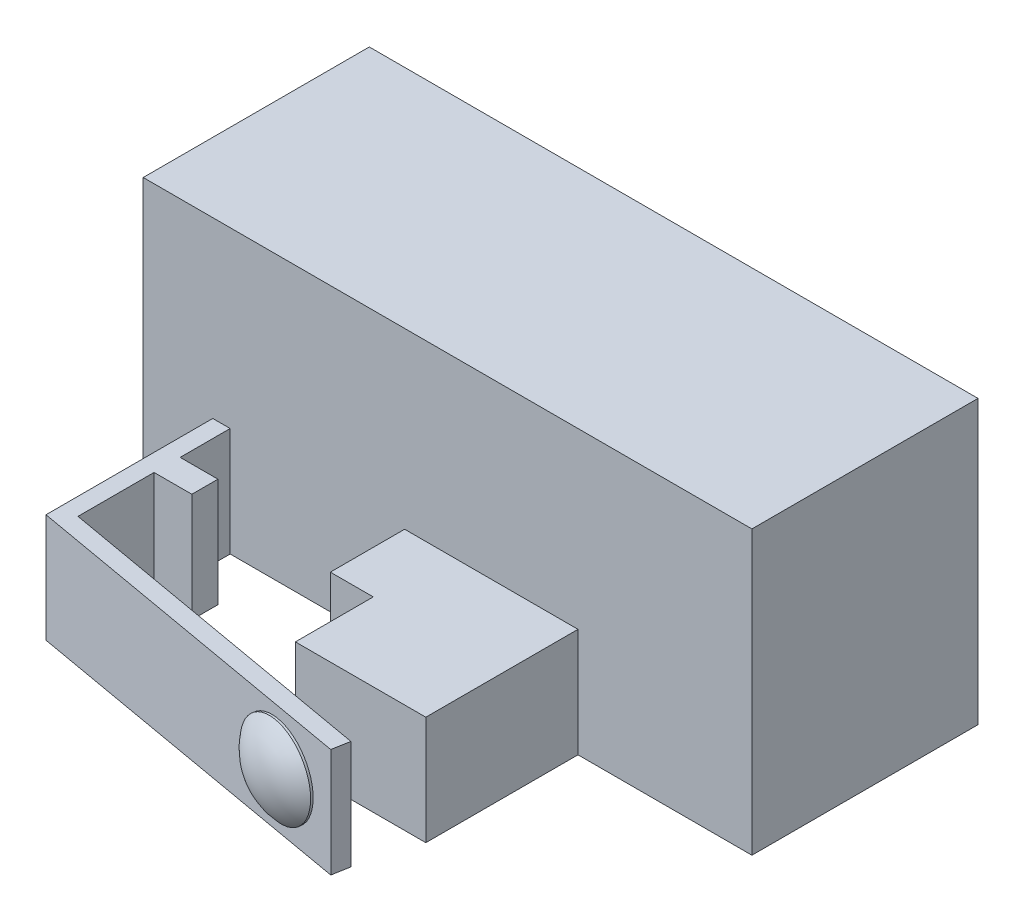
ISO-10303-21;
HEADER;
FILE_DESCRIPTION(('STEP AP214'),'2;1');
FILE_NAME('part.step','',(''),(''),'','','');
FILE_SCHEMA(('AUTOMOTIVE_DESIGN { 1 0 10303 214 1 1 1 1 }'));
ENDSEC;
DATA;
#1=APPLICATION_CONTEXT('core data for automotive mechanical design processes');
#2=APPLICATION_PROTOCOL_DEFINITION('international standard','automotive_design',2000,#1);
#3=PRODUCT_CONTEXT('',#1,'mechanical');
#4=PRODUCT('Part','Part','',(#3));
#5=PRODUCT_RELATED_PRODUCT_CATEGORY('part','',(#4));
#6=PRODUCT_DEFINITION_FORMATION('','',#4);
#7=PRODUCT_DEFINITION_CONTEXT('part definition',#1,'design');
#8=PRODUCT_DEFINITION('design','',#6,#7);
#9=PRODUCT_DEFINITION_SHAPE('','',#8);
#10=(LENGTH_UNIT() NAMED_UNIT(*) SI_UNIT(.MILLI.,.METRE.));
#11=(NAMED_UNIT(*) PLANE_ANGLE_UNIT() SI_UNIT($,.RADIAN.));
#12=(NAMED_UNIT(*) SI_UNIT($,.STERADIAN.) SOLID_ANGLE_UNIT());
#13=UNCERTAINTY_MEASURE_WITH_UNIT(LENGTH_MEASURE(1.E-05),#10,'distance_accuracy_value','');
#14=(GEOMETRIC_REPRESENTATION_CONTEXT(3) GLOBAL_UNCERTAINTY_ASSIGNED_CONTEXT((#13)) GLOBAL_UNIT_ASSIGNED_CONTEXT((#10,
#11,#12)) REPRESENTATION_CONTEXT('',''));
#15=CARTESIAN_POINT('',(0.,0.,0.));
#16=DIRECTION('',(0.,0.,1.));
#17=DIRECTION('',(1.,0.,0.));
#18=AXIS2_PLACEMENT_3D('',#15,#16,#17);
#19=CARTESIAN_POINT('',(-16.122641509434,-2.87735849056604,9.6));
#20=DIRECTION('',(1.,0.,0.));
#21=DIRECTION('',(0.,1.,0.));
#22=AXIS2_PLACEMENT_3D('',#19,#20,#21);
#23=PLANE('',#22);
#24=DIRECTION('',(0.,-1.,0.));
#25=VECTOR('',#24,1.);
#26=CARTESIAN_POINT('',(-16.122641509434,-2.87735849056604,0.));
#27=LINE('',#26,#25);
#28=CARTESIAN_POINT('',(-16.122641509434,-2.87735849056604,0.));
#29=VERTEX_POINT('',#28);
#30=CARTESIAN_POINT('',(-16.122641509434,-15.877358490566,0.));
#31=VERTEX_POINT('',#30);
#32=EDGE_CURVE('E381',#29,#31,#27,.T.);
#33=ORIENTED_EDGE('',*,*,#32,.T.);
#34=DIRECTION('',(0.,0.,-1.));
#35=VECTOR('',#34,1.);
#36=CARTESIAN_POINT('',(-16.122641509434,-15.877358490566,9.6));
#37=LINE('',#36,#35);
#38=CARTESIAN_POINT('',(-16.122641509434,-15.877358490566,10.4));
#39=VERTEX_POINT('',#38);
#40=EDGE_CURVE('E11',#39,#31,#37,.T.);
#41=ORIENTED_EDGE('',*,*,#40,.F.);
#42=DIRECTION('',(0.,-1.,0.));
#43=VECTOR('',#42,1.);
#44=CARTESIAN_POINT('',(-16.122641509434,-2.87735849056605,10.4));
#45=LINE('',#44,#43);
#46=CARTESIAN_POINT('',(-16.122641509434,-2.87735849056605,10.4));
#47=VERTEX_POINT('',#46);
#48=EDGE_CURVE('E219',#47,#39,#45,.T.);
#49=ORIENTED_EDGE('',*,*,#48,.F.);
#50=DIRECTION('',(0.,0.,-1.));
#51=VECTOR('',#50,1.);
#52=CARTESIAN_POINT('',(-16.122641509434,-2.87735849056604,9.6));
#53=LINE('',#52,#51);
#54=EDGE_CURVE('E398',#47,#29,#53,.T.);
#55=ORIENTED_EDGE('',*,*,#54,.T.);
#56=EDGE_LOOP('',(#33,#41,#49,#55));
#57=FACE_BOUND('',#56,.T.);
#58=ADVANCED_FACE('F45',(#57),#23,.F.);
#59=CARTESIAN_POINT('',(-12.122641509434,-15.877358490566,9.6));
#60=DIRECTION('',(-1.,0.,0.));
#61=DIRECTION('',(0.,0.,1.));
#62=AXIS2_PLACEMENT_3D('',#59,#60,#61);
#63=PLANE('',#62);
#64=DIRECTION('',(0.,1.,0.));
#65=VECTOR('',#64,1.);
#66=CARTESIAN_POINT('',(-12.122641509434,-15.877358490566,0.));
#67=LINE('',#66,#65);
#68=CARTESIAN_POINT('',(-12.122641509434,-15.877358490566,0.));
#69=VERTEX_POINT('',#68);
#70=CARTESIAN_POINT('',(-12.122641509434,-6.87735849056605,0.));
#71=VERTEX_POINT('',#70);
#72=EDGE_CURVE('E405',#69,#71,#67,.T.);
#73=ORIENTED_EDGE('',*,*,#72,.T.);
#74=DIRECTION('',(0.,0.,-1.));
#75=VECTOR('',#74,1.);
#76=CARTESIAN_POINT('',(-12.122641509434,-6.87735849056605,9.6));
#77=LINE('',#76,#75);
#78=CARTESIAN_POINT('',(-12.122641509434,-6.87735849056605,9.6));
#79=VERTEX_POINT('',#78);
#80=EDGE_CURVE('E439',#79,#71,#77,.T.);
#81=ORIENTED_EDGE('',*,*,#80,.F.);
#82=DIRECTION('',(0.,1.,0.));
#83=VECTOR('',#82,1.);
#84=CARTESIAN_POINT('',(-12.122641509434,-15.877358490566,9.6));
#85=LINE('',#84,#83);
#86=CARTESIAN_POINT('',(-12.122641509434,-15.877358490566,9.6));
#87=VERTEX_POINT('',#86);
#88=EDGE_CURVE('E385',#87,#79,#85,.T.);
#89=ORIENTED_EDGE('',*,*,#88,.F.);
#90=DIRECTION('',(0.,0.,-1.));
#91=VECTOR('',#90,1.);
#92=CARTESIAN_POINT('',(-12.122641509434,-15.877358490566,9.6));
#93=LINE('',#92,#91);
#94=EDGE_CURVE('E55',#87,#69,#93,.T.);
#95=ORIENTED_EDGE('',*,*,#94,.T.);
#96=EDGE_LOOP('',(#73,#81,#89,#95));
#97=FACE_BOUND('',#96,.T.);
#98=ADVANCED_FACE('F448',(#97),#63,.F.);
#99=CARTESIAN_POINT('',(-12.122641509434,-6.87735849056605,9.6));
#100=DIRECTION('',(0.,1.,0.));
#101=DIRECTION('',(0.,0.,1.));
#102=AXIS2_PLACEMENT_3D('',#99,#100,#101);
#103=PLANE('',#102);
#104=DIRECTION('',(1.,0.,0.));
#105=VECTOR('',#104,1.);
#106=CARTESIAN_POINT('',(-12.122641509434,-6.87735849056605,0.));
#107=LINE('',#106,#105);
#108=CARTESIAN_POINT('',(7.87735849056603,-6.87735849056605,0.));
#109=VERTEX_POINT('',#108);
#110=EDGE_CURVE('E408',#71,#109,#107,.T.);
#111=ORIENTED_EDGE('',*,*,#110,.T.);
#112=DIRECTION('',(0.,0.,-1.));
#113=VECTOR('',#112,1.);
#114=CARTESIAN_POINT('',(7.87735849056603,-6.87735849056605,9.6));
#115=LINE('',#114,#113);
#116=CARTESIAN_POINT('',(7.87735849056603,-6.87735849056605,9.6));
#117=VERTEX_POINT('',#116);
#118=EDGE_CURVE('E435',#117,#109,#115,.T.);
#119=ORIENTED_EDGE('',*,*,#118,.F.);
#120=DIRECTION('',(1.,0.,0.));
#121=VECTOR('',#120,1.);
#122=CARTESIAN_POINT('',(-12.122641509434,-6.87735849056605,9.6));
#123=LINE('',#122,#121);
#124=EDGE_CURVE('E389',#79,#117,#123,.T.);
#125=ORIENTED_EDGE('',*,*,#124,.F.);
#126=ORIENTED_EDGE('',*,*,#80,.T.);
#127=EDGE_LOOP('',(#111,#119,#125,#126));
#128=FACE_BOUND('',#127,.T.);
#129=ADVANCED_FACE('F457',(#128),#103,.F.);
#130=CARTESIAN_POINT('',(7.87735849056603,-6.87735849056605,9.6));
#131=DIRECTION('',(1.,0.,0.));
#132=DIRECTION('',(0.,1.,0.));
#133=AXIS2_PLACEMENT_3D('',#130,#131,#132);
#134=PLANE('',#133);
#135=DIRECTION('',(0.,-1.,0.));
#136=VECTOR('',#135,1.);
#137=CARTESIAN_POINT('',(7.87735849056603,-6.87735849056605,0.));
#138=LINE('',#137,#136);
#139=CARTESIAN_POINT('',(7.87735849056604,-15.877358490566,0.));
#140=VERTEX_POINT('',#139);
#141=EDGE_CURVE('E411',#109,#140,#138,.T.);
#142=ORIENTED_EDGE('',*,*,#141,.T.);
#143=DIRECTION('',(0.,0.,-1.));
#144=VECTOR('',#143,1.);
#145=CARTESIAN_POINT('',(7.87735849056604,-15.877358490566,9.6));
#146=LINE('',#145,#144);
#147=CARTESIAN_POINT('',(7.87735849056604,-15.877358490566,9.6));
#148=VERTEX_POINT('',#147);
#149=EDGE_CURVE('E431',#148,#140,#146,.T.);
#150=ORIENTED_EDGE('',*,*,#149,.F.);
#151=DIRECTION('',(0.,-1.,0.));
#152=VECTOR('',#151,1.);
#153=CARTESIAN_POINT('',(7.87735849056603,-6.87735849056605,9.6));
#154=LINE('',#153,#152);
#155=EDGE_CURVE('E394',#117,#148,#154,.T.);
#156=ORIENTED_EDGE('',*,*,#155,.F.);
#157=ORIENTED_EDGE('',*,*,#118,.T.);
#158=EDGE_LOOP('',(#142,#150,#156,#157));
#159=FACE_BOUND('',#158,.T.);
#160=ADVANCED_FACE('F461',(#159),#134,.F.);
#161=CARTESIAN_POINT('',(7.87735849056604,-15.877358490566,9.6));
#162=DIRECTION('',(0.,1.,0.));
#163=DIRECTION('',(-1.,0.,0.));
#164=AXIS2_PLACEMENT_3D('',#161,#162,#163);
#165=PLANE('',#164);
#166=DIRECTION('',(1.,0.,0.));
#167=VECTOR('',#166,1.);
#168=CARTESIAN_POINT('',(7.87735849056604,-15.877358490566,0.));
#169=LINE('',#168,#167);
#170=CARTESIAN_POINT('',(11.877358490566,-15.877358490566,0.));
#171=VERTEX_POINT('',#170);
#172=EDGE_CURVE('E414',#140,#171,#169,.T.);
#173=ORIENTED_EDGE('',*,*,#172,.T.);
#174=DIRECTION('',(0.,0.,-1.));
#175=VECTOR('',#174,1.);
#176=CARTESIAN_POINT('',(11.877358490566,-15.877358490566,9.6));
#177=LINE('',#176,#175);
#178=CARTESIAN_POINT('',(11.877358490566,-15.877358490566,10.4));
#179=VERTEX_POINT('',#178);
#180=EDGE_CURVE('E214',#179,#171,#177,.T.);
#181=ORIENTED_EDGE('',*,*,#180,.F.);
#182=DIRECTION('',(1.,0.,0.));
#183=VECTOR('',#182,1.);
#184=CARTESIAN_POINT('',(-16.122641509434,-15.877358490566,10.4));
#185=LINE('',#184,#183);
#186=CARTESIAN_POINT('',(3.87735849056604,-15.8773584905661,10.4));
#187=VERTEX_POINT('',#186);
#188=EDGE_CURVE('E208',#187,#179,#185,.T.);
#189=ORIENTED_EDGE('',*,*,#188,.F.);
#190=DIRECTION('',(0.,0.,1.));
#191=VECTOR('',#190,1.);
#192=CARTESIAN_POINT('',(3.87735849056604,-15.8773584905661,10.4));
#193=LINE('',#192,#191);
#194=CARTESIAN_POINT('',(3.87735849056604,-15.8773584905661,17.4));
#195=VERTEX_POINT('',#194);
#196=EDGE_CURVE('E212',#187,#195,#193,.T.);
#197=ORIENTED_EDGE('',*,*,#196,.T.);
#198=DIRECTION('',(-1.,0.,0.));
#199=VECTOR('',#198,1.);
#200=CARTESIAN_POINT('',(3.87735849056604,-15.8773584905661,17.4));
#201=LINE('',#200,#199);
#202=CARTESIAN_POINT('',(-2.12264150943396,-15.8773584905661,17.4));
#203=VERTEX_POINT('',#202);
#204=EDGE_CURVE('E234',#195,#203,#201,.T.);
#205=ORIENTED_EDGE('',*,*,#204,.T.);
#206=DIRECTION('',(0.,0.,-1.));
#207=VECTOR('',#206,1.);
#208=CARTESIAN_POINT('',(-2.12264150943396,-15.8773584905661,13.8174792770365));
#209=LINE('',#208,#207);
#210=CARTESIAN_POINT('',(-2.12264150943396,-15.8773584905661,13.8174792770365));
#211=VERTEX_POINT('',#210);
#212=EDGE_CURVE('E241',#203,#211,#209,.T.);
#213=ORIENTED_EDGE('',*,*,#212,.T.);
#214=DIRECTION('',(-1.,0.,0.));
#215=VECTOR('',#214,1.);
#216=CARTESIAN_POINT('',(-4.09686133363501,-15.8773584905661,13.8174792770365));
#217=LINE('',#216,#215);
#218=CARTESIAN_POINT('',(-4.09686133363501,-15.8773584905661,13.8174792770365));
#219=VERTEX_POINT('',#218);
#220=EDGE_CURVE('E495',#211,#219,#217,.T.);
#221=ORIENTED_EDGE('',*,*,#220,.T.);
#222=DIRECTION('',(0.,0.,-1.));
#223=VECTOR('',#222,1.);
#224=CARTESIAN_POINT('',(-4.09686133363501,-15.8773584905661,10.4));
#225=LINE('',#224,#223);
#226=CARTESIAN_POINT('',(-4.09686133363501,-15.877358490566,10.4));
#227=VERTEX_POINT('',#226);
#228=EDGE_CURVE('E265',#219,#227,#225,.T.);
#229=ORIENTED_EDGE('',*,*,#228,.T.);
#230=CARTESIAN_POINT('',(-12.122641509434,-15.877358490566,10.4));
#231=VERTEX_POINT('',#230);
#232=EDGE_CURVE('E218',#231,#227,#185,.T.);
#233=ORIENTED_EDGE('',*,*,#232,.F.);
#234=DIRECTION('',(0.,0.,1.));
#235=VECTOR('',#234,1.);
#236=CARTESIAN_POINT('',(-12.122641509434,-15.8773584905661,12.7));
#237=LINE('',#236,#235);
#238=CARTESIAN_POINT('',(-12.122641509434,-15.8773584905661,12.7));
#239=VERTEX_POINT('',#238);
#240=EDGE_CURVE('E271',#231,#239,#237,.T.);
#241=ORIENTED_EDGE('',*,*,#240,.T.);
#242=DIRECTION('',(1.,0.,0.));
#243=VECTOR('',#242,1.);
#244=CARTESIAN_POINT('',(-10.3845034350928,-15.8773584905661,12.7));
#245=LINE('',#244,#243);
#246=CARTESIAN_POINT('',(-10.3845034350928,-15.8773584905661,12.7));
#247=VERTEX_POINT('',#246);
#248=EDGE_CURVE('E233',#239,#247,#245,.T.);
#249=ORIENTED_EDGE('',*,*,#248,.T.);
#250=DIRECTION('',(0.,0.,1.));
#251=VECTOR('',#250,1.);
#252=CARTESIAN_POINT('',(-10.3845034350928,-15.8773584905661,13.9));
#253=LINE('',#252,#251);
#254=CARTESIAN_POINT('',(-10.3845034350928,-15.8773584905661,13.9));
#255=VERTEX_POINT('',#254);
#256=EDGE_CURVE('E239',#247,#255,#253,.T.);
#257=ORIENTED_EDGE('',*,*,#256,.T.);
#258=DIRECTION('',(-1.,0.,0.));
#259=VECTOR('',#258,1.);
#260=CARTESIAN_POINT('',(-12.122641509434,-15.8773584905661,13.9));
#261=LINE('',#260,#259);
#262=CARTESIAN_POINT('',(-12.122641509434,-15.8773584905661,13.9));
#263=VERTEX_POINT('',#262);
#264=EDGE_CURVE('E310',#255,#263,#261,.T.);
#265=ORIENTED_EDGE('',*,*,#264,.T.);
#266=DIRECTION('',(0.,0.,1.));
#267=VECTOR('',#266,1.);
#268=CARTESIAN_POINT('',(-12.122641509434,-15.8773584905661,17.4));
#269=LINE('',#268,#267);
#270=CARTESIAN_POINT('',(-12.122641509434,-15.8773584905661,17.4));
#271=VERTEX_POINT('',#270);
#272=EDGE_CURVE('E314',#263,#271,#269,.T.);
#273=ORIENTED_EDGE('',*,*,#272,.T.);
#274=DIRECTION('',(0.984807753012209,0.,0.173648177666928));
#275=VECTOR('',#274,1.);
#276=CARTESIAN_POINT('',(-12.122641509434,-15.8773584905661,17.4));
#277=LINE('',#276,#275);
#278=CARTESIAN_POINT('',(3.11911914186184,-15.8773584905661,20.087533636324));
#279=VERTEX_POINT('',#278);
#280=EDGE_CURVE('E318',#271,#279,#277,.T.);
#281=ORIENTED_EDGE('',*,*,#280,.T.);
#282=DIRECTION('',(-0.173648177666928,0.,0.984807753012209));
#283=VECTOR('',#282,1.);
#284=CARTESIAN_POINT('',(3.11911914186184,-15.8773584905661,20.087533636324));
#285=LINE('',#284,#283);
#286=CARTESIAN_POINT('',(2.9802005997283,-15.8773584905661,20.8753798387338));
#287=VERTEX_POINT('',#286);
#288=EDGE_CURVE('E322',#279,#287,#285,.T.);
#289=ORIENTED_EDGE('',*,*,#288,.T.);
#290=DIRECTION('',(-0.984807753012209,0.,-0.173648177666928));
#291=VECTOR('',#290,1.);
#292=CARTESIAN_POINT('',(2.9802005997283,-15.8773584905661,20.8753798387338));
#293=LINE('',#292,#291);
#294=CARTESIAN_POINT('',(-12.922641509434,-15.8773584905661,18.0712797049418));
#295=VERTEX_POINT('',#294);
#296=EDGE_CURVE('E326',#287,#295,#293,.T.);
#297=ORIENTED_EDGE('',*,*,#296,.T.);
#298=DIRECTION('',(0.,0.,-1.));
#299=VECTOR('',#298,1.);
#300=CARTESIAN_POINT('',(-12.922641509434,-15.8773584905661,10.4));
#301=LINE('',#300,#299);
#302=CARTESIAN_POINT('',(-12.922641509434,-15.8773584905661,10.4));
#303=VERTEX_POINT('',#302);
#304=EDGE_CURVE('E330',#295,#303,#301,.T.);
#305=ORIENTED_EDGE('',*,*,#304,.T.);
#306=EDGE_CURVE('E221',#39,#303,#185,.T.);
#307=ORIENTED_EDGE('',*,*,#306,.F.);
#308=ORIENTED_EDGE('',*,*,#40,.T.);
#309=DIRECTION('',(1.,0.,0.));
#310=VECTOR('',#309,1.);
#311=CARTESIAN_POINT('',(-16.122641509434,-15.877358490566,0.));
#312=LINE('',#311,#310);
#313=EDGE_CURVE('E402',#31,#69,#312,.T.);
#314=ORIENTED_EDGE('',*,*,#313,.T.);
#315=ORIENTED_EDGE('',*,*,#94,.F.);
#316=DIRECTION('',(1.,0.,0.));
#317=VECTOR('',#316,1.);
#318=CARTESIAN_POINT('',(-16.122641509434,-15.877358490566,9.6));
#319=LINE('',#318,#317);
#320=EDGE_CURVE('E340',#87,#148,#319,.T.);
#321=ORIENTED_EDGE('',*,*,#320,.T.);
#322=ORIENTED_EDGE('',*,*,#149,.T.);
#323=EDGE_LOOP('',(#173,#181,#189,#197,#205,#213,#221,#229,#233,#241,#249,#257,#265,#273,#281,
#289,#297,#305,#307,#308,#314,#315,#321,#322));
#324=FACE_BOUND('',#323,.T.);
#325=ADVANCED_FACE('F209',(#324),#165,.F.);
#326=CARTESIAN_POINT('',(11.877358490566,-15.877358490566,9.6));
#327=DIRECTION('',(-1.,0.,0.));
#328=DIRECTION('',(0.,0.,1.));
#329=AXIS2_PLACEMENT_3D('',#326,#327,#328);
#330=PLANE('',#329);
#331=DIRECTION('',(0.,1.,0.));
#332=VECTOR('',#331,1.);
#333=CARTESIAN_POINT('',(11.877358490566,-15.877358490566,0.));
#334=LINE('',#333,#332);
#335=CARTESIAN_POINT('',(11.877358490566,-2.87735849056604,0.));
#336=VERTEX_POINT('',#335);
#337=EDGE_CURVE('E417',#171,#336,#334,.T.);
#338=ORIENTED_EDGE('',*,*,#337,.T.);
#339=DIRECTION('',(0.,0.,-1.));
#340=VECTOR('',#339,1.);
#341=CARTESIAN_POINT('',(11.877358490566,-2.87735849056604,9.6));
#342=LINE('',#341,#340);
#343=CARTESIAN_POINT('',(11.877358490566,-2.87735849056605,10.4));
#344=VERTEX_POINT('',#343);
#345=EDGE_CURVE('E425',#344,#336,#342,.T.);
#346=ORIENTED_EDGE('',*,*,#345,.F.);
#347=DIRECTION('',(0.,1.,0.));
#348=VECTOR('',#347,1.);
#349=CARTESIAN_POINT('',(11.877358490566,-2.87735849056605,10.4));
#350=LINE('',#349,#348);
#351=EDGE_CURVE('E374',#179,#344,#350,.T.);
#352=ORIENTED_EDGE('',*,*,#351,.F.);
#353=ORIENTED_EDGE('',*,*,#180,.T.);
#354=EDGE_LOOP('',(#338,#346,#352,#353));
#355=FACE_BOUND('',#354,.T.);
#356=ADVANCED_FACE('F467',(#355),#330,.F.);
#357=CARTESIAN_POINT('',(11.877358490566,-2.87735849056604,9.6));
#358=DIRECTION('',(0.,-1.,0.));
#359=DIRECTION('',(1.,0.,0.));
#360=AXIS2_PLACEMENT_3D('',#357,#358,#359);
#361=PLANE('',#360);
#362=DIRECTION('',(-1.,0.,0.));
#363=VECTOR('',#362,1.);
#364=CARTESIAN_POINT('',(11.877358490566,-2.87735849056604,0.));
#365=LINE('',#364,#363);
#366=EDGE_CURVE('E390',#336,#29,#365,.T.);
#367=ORIENTED_EDGE('',*,*,#366,.T.);
#368=ORIENTED_EDGE('',*,*,#54,.F.);
#369=DIRECTION('',(-1.,0.,0.));
#370=VECTOR('',#369,1.);
#371=CARTESIAN_POINT('',(-16.122641509434,-2.87735849056605,10.4));
#372=LINE('',#371,#370);
#373=EDGE_CURVE('E377',#344,#47,#372,.T.);
#374=ORIENTED_EDGE('',*,*,#373,.F.);
#375=ORIENTED_EDGE('',*,*,#345,.T.);
#376=EDGE_LOOP('',(#367,#368,#374,#375));
#377=FACE_BOUND('',#376,.T.);
#378=ADVANCED_FACE('F470',(#377),#361,.F.);
#379=CARTESIAN_POINT('',(0.,0.,0.));
#380=DIRECTION('',(0.,0.,1.));
#381=DIRECTION('',(1.,0.,0.));
#382=AXIS2_PLACEMENT_3D('',#379,#380,#381);
#383=PLANE('',#382);
#384=ORIENTED_EDGE('',*,*,#32,.F.);
#385=ORIENTED_EDGE('',*,*,#366,.F.);
#386=ORIENTED_EDGE('',*,*,#337,.F.);
#387=ORIENTED_EDGE('',*,*,#172,.F.);
#388=ORIENTED_EDGE('',*,*,#141,.F.);
#389=ORIENTED_EDGE('',*,*,#110,.F.);
#390=ORIENTED_EDGE('',*,*,#72,.F.);
#391=ORIENTED_EDGE('',*,*,#313,.F.);
#392=EDGE_LOOP('',(#384,#385,#386,#387,#388,#389,#390,#391));
#393=FACE_BOUND('',#392,.T.);
#394=ADVANCED_FACE('F453',(#393),#383,.F.);
#395=CARTESIAN_POINT('',(0.,0.,9.6));
#396=DIRECTION('',(0.,0.,1.));
#397=DIRECTION('',(1.,0.,0.));
#398=AXIS2_PLACEMENT_3D('',#395,#396,#397);
#399=PLANE('',#398);
#400=ORIENTED_EDGE('',*,*,#320,.F.);
#401=ORIENTED_EDGE('',*,*,#88,.T.);
#402=ORIENTED_EDGE('',*,*,#124,.T.);
#403=ORIENTED_EDGE('',*,*,#155,.T.);
#404=EDGE_LOOP('',(#400,#401,#402,#403));
#405=FACE_BOUND('',#404,.T.);
#406=ADVANCED_FACE('F463',(#405),#399,.F.);
#407=CARTESIAN_POINT('',(0.,0.,10.4));
#408=DIRECTION('',(0.,0.,1.));
#409=DIRECTION('',(1.,0.,0.));
#410=AXIS2_PLACEMENT_3D('',#407,#408,#409);
#411=PLANE('',#410);
#412=DIRECTION('',(0.,-1.,0.));
#413=VECTOR('',#412,1.);
#414=CARTESIAN_POINT('',(3.87735849056604,-10.877358490566,10.4));
#415=LINE('',#414,#413);
#416=CARTESIAN_POINT('',(3.87735849056604,-10.877358490566,10.4));
#417=VERTEX_POINT('',#416);
#418=EDGE_CURVE('E222',#417,#187,#415,.T.);
#419=ORIENTED_EDGE('',*,*,#418,.T.);
#420=ORIENTED_EDGE('',*,*,#188,.T.);
#421=ORIENTED_EDGE('',*,*,#351,.T.);
#422=ORIENTED_EDGE('',*,*,#373,.T.);
#423=ORIENTED_EDGE('',*,*,#48,.T.);
#424=ORIENTED_EDGE('',*,*,#306,.T.);
#425=DIRECTION('',(0.,-1.,0.));
#426=VECTOR('',#425,1.);
#427=CARTESIAN_POINT('',(-12.922641509434,-10.8773584905661,10.4));
#428=LINE('',#427,#426);
#429=CARTESIAN_POINT('',(-12.922641509434,-10.8773584905661,10.4));
#430=VERTEX_POINT('',#429);
#431=EDGE_CURVE('E345',#430,#303,#428,.T.);
#432=ORIENTED_EDGE('',*,*,#431,.F.);
#433=DIRECTION('',(1.,0.,0.));
#434=VECTOR('',#433,1.);
#435=CARTESIAN_POINT('',(-12.122641509434,-10.8773584905661,10.4));
#436=LINE('',#435,#434);
#437=CARTESIAN_POINT('',(-12.122641509434,-10.8773584905661,10.4));
#438=VERTEX_POINT('',#437);
#439=EDGE_CURVE('E298',#430,#438,#436,.T.);
#440=ORIENTED_EDGE('',*,*,#439,.T.);
#441=DIRECTION('',(0.,-1.,0.));
#442=VECTOR('',#441,1.);
#443=CARTESIAN_POINT('',(-12.122641509434,-10.8773584905661,10.4));
#444=LINE('',#443,#442);
#445=EDGE_CURVE('E341',#438,#231,#444,.T.);
#446=ORIENTED_EDGE('',*,*,#445,.T.);
#447=ORIENTED_EDGE('',*,*,#232,.T.);
#448=DIRECTION('',(0.,-1.,0.));
#449=VECTOR('',#448,1.);
#450=CARTESIAN_POINT('',(-4.09686133363501,-10.8773584905661,10.4));
#451=LINE('',#450,#449);
#452=CARTESIAN_POINT('',(-4.09686133363501,-10.877358490566,10.4));
#453=VERTEX_POINT('',#452);
#454=EDGE_CURVE('E67',#453,#227,#451,.T.);
#455=ORIENTED_EDGE('',*,*,#454,.F.);
#456=DIRECTION('',(1.,0.,0.));
#457=VECTOR('',#456,1.);
#458=CARTESIAN_POINT('',(-4.09686133363501,-10.8773584905661,10.4));
#459=LINE('',#458,#457);
#460=EDGE_CURVE('E62',#453,#417,#459,.T.);
#461=ORIENTED_EDGE('',*,*,#460,.T.);
#462=EDGE_LOOP('',(#419,#420,#421,#422,#423,#424,#432,#440,#446,#447,#455,#461));
#463=FACE_BOUND('',#462,.T.);
#464=ADVANCED_FACE('F223',(#463),#411,.T.);
#465=CARTESIAN_POINT('',(-10.3845034350928,-10.8773584905661,12.7));
#466=DIRECTION('',(0.,0.,-1.));
#467=DIRECTION('',(-1.,0.,0.));
#468=AXIS2_PLACEMENT_3D('',#465,#466,#467);
#469=PLANE('',#468);
#470=ORIENTED_EDGE('',*,*,#248,.F.);
#471=DIRECTION('',(0.,-1.,0.));
#472=VECTOR('',#471,1.);
#473=CARTESIAN_POINT('',(-12.122641509434,-10.8773584905661,12.7));
#474=LINE('',#473,#472);
#475=CARTESIAN_POINT('',(-12.122641509434,-10.8773584905661,12.7));
#476=VERTEX_POINT('',#475);
#477=EDGE_CURVE('E337',#476,#239,#474,.T.);
#478=ORIENTED_EDGE('',*,*,#477,.F.);
#479=DIRECTION('',(1.,0.,0.));
#480=VECTOR('',#479,1.);
#481=CARTESIAN_POINT('',(-10.3845034350928,-10.8773584905661,12.7));
#482=LINE('',#481,#480);
#483=CARTESIAN_POINT('',(-10.3845034350928,-10.8773584905661,12.7));
#484=VERTEX_POINT('',#483);
#485=EDGE_CURVE('E266',#476,#484,#482,.T.);
#486=ORIENTED_EDGE('',*,*,#485,.T.);
#487=DIRECTION('',(0.,-1.,0.));
#488=VECTOR('',#487,1.);
#489=CARTESIAN_POINT('',(-10.3845034350928,-10.8773584905661,12.7));
#490=LINE('',#489,#488);
#491=EDGE_CURVE('E305',#484,#247,#490,.T.);
#492=ORIENTED_EDGE('',*,*,#491,.T.);
#493=EDGE_LOOP('',(#470,#478,#486,#492));
#494=FACE_BOUND('',#493,.T.);
#495=ADVANCED_FACE('F569',(#494),#469,.T.);
#496=CARTESIAN_POINT('',(-12.122641509434,-10.8773584905661,12.7));
#497=DIRECTION('',(1.,0.,0.));
#498=DIRECTION('',(0.,1.,0.));
#499=AXIS2_PLACEMENT_3D('',#496,#497,#498);
#500=PLANE('',#499);
#501=ORIENTED_EDGE('',*,*,#240,.F.);
#502=ORIENTED_EDGE('',*,*,#445,.F.);
#503=DIRECTION('',(0.,0.,1.));
#504=VECTOR('',#503,1.);
#505=CARTESIAN_POINT('',(-12.122641509434,-10.8773584905661,12.7));
#506=LINE('',#505,#504);
#507=EDGE_CURVE('E302',#438,#476,#506,.T.);
#508=ORIENTED_EDGE('',*,*,#507,.T.);
#509=ORIENTED_EDGE('',*,*,#477,.T.);
#510=EDGE_LOOP('',(#501,#502,#508,#509));
#511=FACE_BOUND('',#510,.T.);
#512=ADVANCED_FACE('F486',(#511),#500,.T.);
#513=CARTESIAN_POINT('',(-12.922641509434,-10.8773584905661,10.4));
#514=DIRECTION('',(-1.,0.,0.));
#515=DIRECTION('',(0.,-1.,0.));
#516=AXIS2_PLACEMENT_3D('',#513,#514,#515);
#517=PLANE('',#516);
#518=ORIENTED_EDGE('',*,*,#304,.F.);
#519=DIRECTION('',(0.,-1.,0.));
#520=VECTOR('',#519,1.);
#521=CARTESIAN_POINT('',(-12.922641509434,-10.8773584905661,18.0712797049418));
#522=LINE('',#521,#520);
#523=CARTESIAN_POINT('',(-12.922641509434,-10.8773584905661,18.0712797049418));
#524=VERTEX_POINT('',#523);
#525=EDGE_CURVE('E348',#524,#295,#522,.T.);
#526=ORIENTED_EDGE('',*,*,#525,.F.);
#527=DIRECTION('',(0.,0.,-1.));
#528=VECTOR('',#527,1.);
#529=CARTESIAN_POINT('',(-12.922641509434,-10.8773584905661,18.0712797049418));
#530=LINE('',#529,#528);
#531=EDGE_CURVE('E295',#524,#430,#530,.T.);
#532=ORIENTED_EDGE('',*,*,#531,.T.);
#533=ORIENTED_EDGE('',*,*,#431,.T.);
#534=EDGE_LOOP('',(#518,#526,#532,#533));
#535=FACE_BOUND('',#534,.T.);
#536=ADVANCED_FACE('F477',(#535),#517,.T.);
#537=CARTESIAN_POINT('',(2.9802005997283,-10.877358490566,20.8753798387338));
#538=DIRECTION('',(-0.173648177666928,0.,0.984807753012209));
#539=DIRECTION('',(0.984807753012209,0.,0.173648177666928));
#540=AXIS2_PLACEMENT_3D('',#537,#538,#539);
#541=PLANE('',#540);
#542=CARTESIAN_POINT('',(0.0257773406916735,-13.3773584905661,20.354435305733));
#543=DIRECTION('',(-0.173648177666928,0.,0.984807753012208));
#544=DIRECTION('',(0.984807753012208,0.,0.173648177666928));
#545=AXIS2_PLACEMENT_3D('',#542,#543,#544);
#546=CIRCLE('',#545,2.);
#547=CARTESIAN_POINT('',(1.99539284671609,-13.3773584905661,20.7017316610669));
#548=VERTEX_POINT('',#547);
#549=EDGE_CURVE('E524',#548,#548,#546,.T.);
#550=ORIENTED_EDGE('',*,*,#549,.F.);
#551=EDGE_LOOP('',(#550));
#552=FACE_BOUND('',#551,.T.);
#553=ORIENTED_EDGE('',*,*,#296,.F.);
#554=DIRECTION('',(0.,-1.,0.));
#555=VECTOR('',#554,1.);
#556=CARTESIAN_POINT('',(2.9802005997283,-10.877358490566,20.8753798387338));
#557=LINE('',#556,#555);
#558=CARTESIAN_POINT('',(2.9802005997283,-10.877358490566,20.8753798387338));
#559=VERTEX_POINT('',#558);
#560=EDGE_CURVE('E352',#559,#287,#557,.T.);
#561=ORIENTED_EDGE('',*,*,#560,.F.);
#562=DIRECTION('',(-0.984807753012209,0.,-0.173648177666928));
#563=VECTOR('',#562,1.);
#564=CARTESIAN_POINT('',(2.9802005997283,-10.877358490566,20.8753798387338));
#565=LINE('',#564,#563);
#566=EDGE_CURVE('E291',#559,#524,#565,.T.);
#567=ORIENTED_EDGE('',*,*,#566,.T.);
#568=ORIENTED_EDGE('',*,*,#525,.T.);
#569=EDGE_LOOP('',(#553,#561,#567,#568));
#570=FACE_BOUND('',#569,.T.);
#571=ADVANCED_FACE('F592',(#552,#570),#541,.T.);
#572=CARTESIAN_POINT('',(3.11911914186184,-10.877358490566,20.087533636324));
#573=DIRECTION('',(0.984807753012209,0.,0.173648177666928));
#574=DIRECTION('',(0.173648177666928,0.,-0.984807753012209));
#575=AXIS2_PLACEMENT_3D('',#572,#573,#574);
#576=PLANE('',#575);
#577=ORIENTED_EDGE('',*,*,#288,.F.);
#578=DIRECTION('',(0.,-1.,0.));
#579=VECTOR('',#578,1.);
#580=CARTESIAN_POINT('',(3.11911914186184,-10.877358490566,20.087533636324));
#581=LINE('',#580,#579);
#582=CARTESIAN_POINT('',(3.11911914186184,-10.877358490566,20.087533636324));
#583=VERTEX_POINT('',#582);
#584=EDGE_CURVE('E355',#583,#279,#581,.T.);
#585=ORIENTED_EDGE('',*,*,#584,.F.);
#586=DIRECTION('',(-0.173648177666928,0.,0.984807753012209));
#587=VECTOR('',#586,1.);
#588=CARTESIAN_POINT('',(3.11911914186184,-10.877358490566,20.087533636324));
#589=LINE('',#588,#587);
#590=EDGE_CURVE('E287',#583,#559,#589,.T.);
#591=ORIENTED_EDGE('',*,*,#590,.T.);
#592=ORIENTED_EDGE('',*,*,#560,.T.);
#593=EDGE_LOOP('',(#577,#585,#591,#592));
#594=FACE_BOUND('',#593,.T.);
#595=ADVANCED_FACE('F588',(#594),#576,.T.);
#596=CARTESIAN_POINT('',(-12.122641509434,-10.8773584905661,17.4));
#597=DIRECTION('',(0.173648177666928,0.,-0.984807753012209));
#598=DIRECTION('',(-0.984807753012209,0.,-0.173648177666928));
#599=AXIS2_PLACEMENT_3D('',#596,#597,#598);
#600=PLANE('',#599);
#601=ORIENTED_EDGE('',*,*,#280,.F.);
#602=DIRECTION('',(0.,-1.,0.));
#603=VECTOR('',#602,1.);
#604=CARTESIAN_POINT('',(-12.122641509434,-10.8773584905661,17.4));
#605=LINE('',#604,#603);
#606=CARTESIAN_POINT('',(-12.122641509434,-10.8773584905661,17.4));
#607=VERTEX_POINT('',#606);
#608=EDGE_CURVE('E358',#607,#271,#605,.T.);
#609=ORIENTED_EDGE('',*,*,#608,.F.);
#610=DIRECTION('',(0.984807753012209,0.,0.173648177666928));
#611=VECTOR('',#610,1.);
#612=CARTESIAN_POINT('',(-12.122641509434,-10.8773584905661,17.4));
#613=LINE('',#612,#611);
#614=EDGE_CURVE('E283',#607,#583,#613,.T.);
#615=ORIENTED_EDGE('',*,*,#614,.T.);
#616=ORIENTED_EDGE('',*,*,#584,.T.);
#617=EDGE_LOOP('',(#601,#609,#615,#616));
#618=FACE_BOUND('',#617,.T.);
#619=ADVANCED_FACE('F584',(#618),#600,.T.);
#620=CARTESIAN_POINT('',(-12.122641509434,-10.8773584905661,17.4));
#621=DIRECTION('',(1.,0.,0.));
#622=DIRECTION('',(0.,1.,0.));
#623=AXIS2_PLACEMENT_3D('',#620,#621,#622);
#624=PLANE('',#623);
#625=ORIENTED_EDGE('',*,*,#272,.F.);
#626=DIRECTION('',(0.,-1.,0.));
#627=VECTOR('',#626,1.);
#628=CARTESIAN_POINT('',(-12.122641509434,-10.8773584905661,13.9));
#629=LINE('',#628,#627);
#630=CARTESIAN_POINT('',(-12.122641509434,-10.8773584905661,13.9));
#631=VERTEX_POINT('',#630);
#632=EDGE_CURVE('E361',#631,#263,#629,.T.);
#633=ORIENTED_EDGE('',*,*,#632,.F.);
#634=DIRECTION('',(0.,0.,1.));
#635=VECTOR('',#634,1.);
#636=CARTESIAN_POINT('',(-12.122641509434,-10.8773584905661,17.4));
#637=LINE('',#636,#635);
#638=EDGE_CURVE('E279',#631,#607,#637,.T.);
#639=ORIENTED_EDGE('',*,*,#638,.T.);
#640=ORIENTED_EDGE('',*,*,#608,.T.);
#641=EDGE_LOOP('',(#625,#633,#639,#640));
#642=FACE_BOUND('',#641,.T.);
#643=ADVANCED_FACE('F580',(#642),#624,.T.);
#644=CARTESIAN_POINT('',(-12.122641509434,-10.8773584905661,13.9));
#645=DIRECTION('',(0.,0.,1.));
#646=DIRECTION('',(1.,0.,0.));
#647=AXIS2_PLACEMENT_3D('',#644,#645,#646);
#648=PLANE('',#647);
#649=ORIENTED_EDGE('',*,*,#264,.F.);
#650=DIRECTION('',(0.,-1.,0.));
#651=VECTOR('',#650,1.);
#652=CARTESIAN_POINT('',(-10.3845034350928,-10.8773584905661,13.9));
#653=LINE('',#652,#651);
#654=CARTESIAN_POINT('',(-10.3845034350928,-10.8773584905661,13.9));
#655=VERTEX_POINT('',#654);
#656=EDGE_CURVE('E364',#655,#255,#653,.T.);
#657=ORIENTED_EDGE('',*,*,#656,.F.);
#658=DIRECTION('',(-1.,0.,0.));
#659=VECTOR('',#658,1.);
#660=CARTESIAN_POINT('',(-12.122641509434,-10.8773584905661,13.9));
#661=LINE('',#660,#659);
#662=EDGE_CURVE('E275',#655,#631,#661,.T.);
#663=ORIENTED_EDGE('',*,*,#662,.T.);
#664=ORIENTED_EDGE('',*,*,#632,.T.);
#665=EDGE_LOOP('',(#649,#657,#663,#664));
#666=FACE_BOUND('',#665,.T.);
#667=ADVANCED_FACE('F576',(#666),#648,.T.);
#668=CARTESIAN_POINT('',(-10.3845034350928,-10.8773584905661,13.9));
#669=DIRECTION('',(1.,0.,0.));
#670=DIRECTION('',(0.,1.,0.));
#671=AXIS2_PLACEMENT_3D('',#668,#669,#670);
#672=PLANE('',#671);
#673=ORIENTED_EDGE('',*,*,#256,.F.);
#674=ORIENTED_EDGE('',*,*,#491,.F.);
#675=DIRECTION('',(0.,0.,1.));
#676=VECTOR('',#675,1.);
#677=CARTESIAN_POINT('',(-10.3845034350928,-10.8773584905661,13.9));
#678=LINE('',#677,#676);
#679=EDGE_CURVE('E270',#484,#655,#678,.T.);
#680=ORIENTED_EDGE('',*,*,#679,.T.);
#681=ORIENTED_EDGE('',*,*,#656,.T.);
#682=EDGE_LOOP('',(#673,#674,#680,#681));
#683=FACE_BOUND('',#682,.T.);
#684=ADVANCED_FACE('F573',(#683),#672,.T.);
#685=CARTESIAN_POINT('',(0.,-10.877358490566,0.));
#686=DIRECTION('',(0.,-1.,0.));
#687=DIRECTION('',(1.,0.,0.));
#688=AXIS2_PLACEMENT_3D('',#685,#686,#687);
#689=PLANE('',#688);
#690=ORIENTED_EDGE('',*,*,#485,.F.);
#691=ORIENTED_EDGE('',*,*,#507,.F.);
#692=ORIENTED_EDGE('',*,*,#439,.F.);
#693=ORIENTED_EDGE('',*,*,#531,.F.);
#694=ORIENTED_EDGE('',*,*,#566,.F.);
#695=ORIENTED_EDGE('',*,*,#590,.F.);
#696=ORIENTED_EDGE('',*,*,#614,.F.);
#697=ORIENTED_EDGE('',*,*,#638,.F.);
#698=ORIENTED_EDGE('',*,*,#662,.F.);
#699=ORIENTED_EDGE('',*,*,#679,.F.);
#700=EDGE_LOOP('',(#690,#691,#692,#693,#694,#695,#696,#697,#698,#699));
#701=FACE_BOUND('',#700,.T.);
#702=ADVANCED_FACE('F483',(#701),#689,.F.);
#703=CARTESIAN_POINT('',(3.87735849056604,-10.877358490566,10.4));
#704=DIRECTION('',(1.,0.,0.));
#705=DIRECTION('',(0.,1.,0.));
#706=AXIS2_PLACEMENT_3D('',#703,#704,#705);
#707=PLANE('',#706);
#708=ORIENTED_EDGE('',*,*,#196,.F.);
#709=ORIENTED_EDGE('',*,*,#418,.F.);
#710=DIRECTION('',(0.,0.,1.));
#711=VECTOR('',#710,1.);
#712=CARTESIAN_POINT('',(3.87735849056604,-10.877358490566,10.4));
#713=LINE('',#712,#711);
#714=CARTESIAN_POINT('',(3.87735849056604,-10.877358490566,17.4));
#715=VERTEX_POINT('',#714);
#716=EDGE_CURVE('E262',#417,#715,#713,.T.);
#717=ORIENTED_EDGE('',*,*,#716,.T.);
#718=DIRECTION('',(0.,-1.,0.));
#719=VECTOR('',#718,1.);
#720=CARTESIAN_POINT('',(3.87735849056604,-10.877358490566,17.4));
#721=LINE('',#720,#719);
#722=EDGE_CURVE('E230',#715,#195,#721,.T.);
#723=ORIENTED_EDGE('',*,*,#722,.T.);
#724=EDGE_LOOP('',(#708,#709,#717,#723));
#725=FACE_BOUND('',#724,.T.);
#726=ADVANCED_FACE('F229',(#725),#707,.T.);
#727=CARTESIAN_POINT('',(-4.09686133363501,-10.8773584905661,10.4));
#728=DIRECTION('',(-1.,0.,0.));
#729=DIRECTION('',(0.,-1.,0.));
#730=AXIS2_PLACEMENT_3D('',#727,#728,#729);
#731=PLANE('',#730);
#732=ORIENTED_EDGE('',*,*,#228,.F.);
#733=DIRECTION('',(0.,-1.,0.));
#734=VECTOR('',#733,1.);
#735=CARTESIAN_POINT('',(-4.09686133363501,-10.8773584905661,13.8174792770365));
#736=LINE('',#735,#734);
#737=CARTESIAN_POINT('',(-4.09686133363501,-10.8773584905661,13.8174792770365));
#738=VERTEX_POINT('',#737);
#739=EDGE_CURVE('E512',#738,#219,#736,.T.);
#740=ORIENTED_EDGE('',*,*,#739,.F.);
#741=DIRECTION('',(0.,0.,-1.));
#742=VECTOR('',#741,1.);
#743=CARTESIAN_POINT('',(-4.09686133363501,-10.8773584905661,10.4));
#744=LINE('',#743,#742);
#745=EDGE_CURVE('E247',#738,#453,#744,.T.);
#746=ORIENTED_EDGE('',*,*,#745,.T.);
#747=ORIENTED_EDGE('',*,*,#454,.T.);
#748=EDGE_LOOP('',(#732,#740,#746,#747));
#749=FACE_BOUND('',#748,.T.);
#750=ADVANCED_FACE('F602',(#749),#731,.T.);
#751=CARTESIAN_POINT('',(-4.09686133363501,-10.8773584905661,13.8174792770365));
#752=DIRECTION('',(0.,0.,1.));
#753=DIRECTION('',(1.,0.,0.));
#754=AXIS2_PLACEMENT_3D('',#751,#752,#753);
#755=PLANE('',#754);
#756=ORIENTED_EDGE('',*,*,#220,.F.);
#757=DIRECTION('',(0.,-1.,0.));
#758=VECTOR('',#757,1.);
#759=CARTESIAN_POINT('',(-2.12264150943396,-10.877358490566,13.8174792770365));
#760=LINE('',#759,#758);
#761=CARTESIAN_POINT('',(-2.12264150943396,-10.877358490566,13.8174792770365));
#762=VERTEX_POINT('',#761);
#763=EDGE_CURVE('E508',#762,#211,#760,.T.);
#764=ORIENTED_EDGE('',*,*,#763,.F.);
#765=DIRECTION('',(-1.,0.,0.));
#766=VECTOR('',#765,1.);
#767=CARTESIAN_POINT('',(-4.09686133363501,-10.8773584905661,13.8174792770365));
#768=LINE('',#767,#766);
#769=EDGE_CURVE('E250',#762,#738,#768,.T.);
#770=ORIENTED_EDGE('',*,*,#769,.T.);
#771=ORIENTED_EDGE('',*,*,#739,.T.);
#772=EDGE_LOOP('',(#756,#764,#770,#771));
#773=FACE_BOUND('',#772,.T.);
#774=ADVANCED_FACE('F514',(#773),#755,.T.);
#775=CARTESIAN_POINT('',(-2.12264150943396,-10.877358490566,13.8174792770365));
#776=DIRECTION('',(-1.,0.,0.));
#777=DIRECTION('',(0.,-1.,0.));
#778=AXIS2_PLACEMENT_3D('',#775,#776,#777);
#779=PLANE('',#778);
#780=ORIENTED_EDGE('',*,*,#212,.F.);
#781=DIRECTION('',(0.,-1.,0.));
#782=VECTOR('',#781,1.);
#783=CARTESIAN_POINT('',(-2.12264150943396,-10.877358490566,17.4));
#784=LINE('',#783,#782);
#785=CARTESIAN_POINT('',(-2.12264150943396,-10.877358490566,17.4));
#786=VERTEX_POINT('',#785);
#787=EDGE_CURVE('E506',#786,#203,#784,.T.);
#788=ORIENTED_EDGE('',*,*,#787,.F.);
#789=DIRECTION('',(0.,0.,-1.));
#790=VECTOR('',#789,1.);
#791=CARTESIAN_POINT('',(-2.12264150943396,-10.877358490566,13.8174792770365));
#792=LINE('',#791,#790);
#793=EDGE_CURVE('E254',#786,#762,#792,.T.);
#794=ORIENTED_EDGE('',*,*,#793,.T.);
#795=ORIENTED_EDGE('',*,*,#763,.T.);
#796=EDGE_LOOP('',(#780,#788,#794,#795));
#797=FACE_BOUND('',#796,.T.);
#798=ADVANCED_FACE('F505',(#797),#779,.T.);
#799=CARTESIAN_POINT('',(3.87735849056604,-10.877358490566,17.4));
#800=DIRECTION('',(0.,0.,1.));
#801=DIRECTION('',(1.,0.,0.));
#802=AXIS2_PLACEMENT_3D('',#799,#800,#801);
#803=PLANE('',#802);
#804=ORIENTED_EDGE('',*,*,#204,.F.);
#805=ORIENTED_EDGE('',*,*,#722,.F.);
#806=DIRECTION('',(-1.,0.,0.));
#807=VECTOR('',#806,1.);
#808=CARTESIAN_POINT('',(3.87735849056604,-10.877358490566,17.4));
#809=LINE('',#808,#807);
#810=EDGE_CURVE('E258',#715,#786,#809,.T.);
#811=ORIENTED_EDGE('',*,*,#810,.T.);
#812=ORIENTED_EDGE('',*,*,#787,.T.);
#813=EDGE_LOOP('',(#804,#805,#811,#812));
#814=FACE_BOUND('',#813,.T.);
#815=ADVANCED_FACE('F543',(#814),#803,.T.);
#816=CARTESIAN_POINT('',(0.,-10.877358490566,0.));
#817=DIRECTION('',(0.,-1.,0.));
#818=DIRECTION('',(0.,0.,-1.));
#819=AXIS2_PLACEMENT_3D('',#816,#817,#818);
#820=PLANE('',#819);
#821=ORIENTED_EDGE('',*,*,#716,.F.);
#822=ORIENTED_EDGE('',*,*,#460,.F.);
#823=ORIENTED_EDGE('',*,*,#745,.F.);
#824=ORIENTED_EDGE('',*,*,#769,.F.);
#825=ORIENTED_EDGE('',*,*,#793,.F.);
#826=ORIENTED_EDGE('',*,*,#810,.F.);
#827=EDGE_LOOP('',(#821,#822,#823,#824,#825,#826));
#828=FACE_BOUND('',#827,.T.);
#829=ADVANCED_FACE('F536',(#828),#820,.F.);
#830=CARTESIAN_POINT('',(0.00841252292498069,-13.3773584905661,20.4529160810342));
#831=DIRECTION('',(0.173648177666928,0.,-0.984807753012209));
#832=DIRECTION('',(-0.984807753012209,0.,-0.173648177666928));
#833=AXIS2_PLACEMENT_3D('',#830,#831,#832);
#834=CYLINDRICAL_SURFACE('',#833,2.);
#835=CARTESIAN_POINT('',(0.00841252292498069,-13.3773584905661,20.4529160810342));
#836=DIRECTION('',(-0.173648177666928,0.,0.984807753012208));
#837=DIRECTION('',(0.984807753012208,0.,0.173648177666928));
#838=AXIS2_PLACEMENT_3D('',#835,#836,#837);
#839=CIRCLE('',#838,2.);
#840=CARTESIAN_POINT('',(1.9780280289494,-13.3773584905661,20.8002124363681));
#841=VERTEX_POINT('',#840);
#842=EDGE_CURVE('E49',#841,#841,#839,.T.);
#843=ORIENTED_EDGE('',*,*,#842,.F.);
#844=EDGE_LOOP('',(#843));
#845=FACE_BOUND('',#844,.T.);
#846=ORIENTED_EDGE('',*,*,#549,.T.);
#847=EDGE_LOOP('',(#846));
#848=FACE_BOUND('',#847,.T.);
#849=ADVANCED_FACE('F534',(#845,#848),#834,.T.);
#850=CARTESIAN_POINT('',(0.373073696025529,-13.3773584905661,18.3848197997086));
#851=DIRECTION('',(0.,0.,1.));
#852=DIRECTION('',(1.,0.,0.));
#853=AXIS2_PLACEMENT_3D('',#850,#851,#852);
#854=SPHERICAL_SURFACE('',#853,2.9);
#855=CARTESIAN_POINT('',(0.373073696025529,-13.3773584905661,18.3848197997086));
#856=DIRECTION('',(-0.173648177666928,0.,0.984807753012208));
#857=DIRECTION('',(0.984807753012208,0.,0.173648177666928));
#858=AXIS2_PLACEMENT_3D('',#855,#856,#857);
#859=SPHERICAL_SURFACE('',#858,2.9);
#860=ORIENTED_EDGE('',*,*,#842,.T.);
#861=EDGE_LOOP('',(#860));
#862=FACE_BOUND('',#861,.T.);
#863=ADVANCED_FACE('F47',(#862),#859,.T.);
#864=CLOSED_SHELL('',(#58,#98,#129,#160,#325,#356,#378,#394,#406,#464,#495,#512,#536,#571,#595,
#619,#643,#667,#684,#702,#726,#750,#774,#798,#815,#829,#849,#863));
#865=MANIFOLD_SOLID_BREP('B2',#864);
#866=ADVANCED_BREP_SHAPE_REPRESENTATION('',(#18,#865),#14);
#867=SHAPE_DEFINITION_REPRESENTATION(#9,#866);
ENDSEC;
END-ISO-10303-21;
